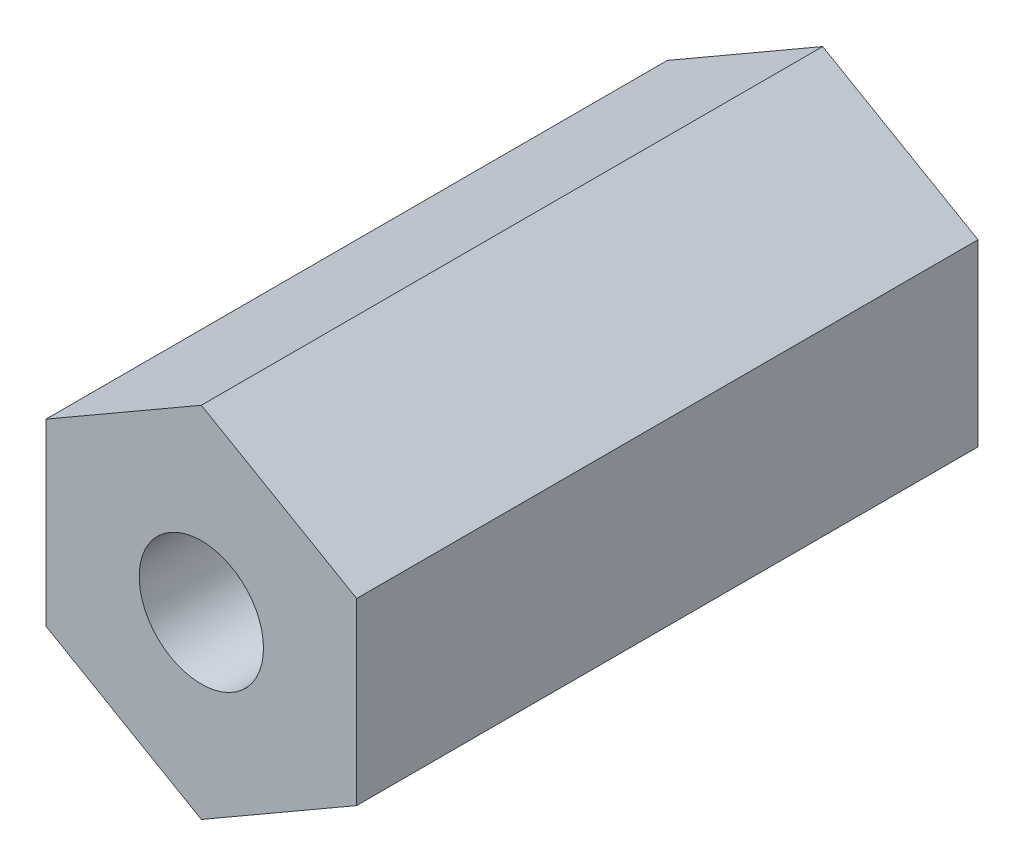
ISO-10303-21;
HEADER;
FILE_DESCRIPTION(('STEP AP214'),'2;1');
FILE_NAME('part.step','',(''),(''),'','','');
FILE_SCHEMA(('AUTOMOTIVE_DESIGN { 1 0 10303 214 1 1 1 1 }'));
ENDSEC;
DATA;
#1=APPLICATION_CONTEXT('core data for automotive mechanical design processes');
#2=APPLICATION_PROTOCOL_DEFINITION('international standard','automotive_design',2000,#1);
#3=PRODUCT_CONTEXT('',#1,'mechanical');
#4=PRODUCT('Part','Part','',(#3));
#5=PRODUCT_RELATED_PRODUCT_CATEGORY('part','',(#4));
#6=PRODUCT_DEFINITION_FORMATION('','',#4);
#7=PRODUCT_DEFINITION_CONTEXT('part definition',#1,'design');
#8=PRODUCT_DEFINITION('design','',#6,#7);
#9=PRODUCT_DEFINITION_SHAPE('','',#8);
#10=(LENGTH_UNIT() NAMED_UNIT(*) SI_UNIT(.MILLI.,.METRE.));
#11=(NAMED_UNIT(*) PLANE_ANGLE_UNIT() SI_UNIT($,.RADIAN.));
#12=(NAMED_UNIT(*) SI_UNIT($,.STERADIAN.) SOLID_ANGLE_UNIT());
#13=UNCERTAINTY_MEASURE_WITH_UNIT(LENGTH_MEASURE(1.E-05),#10,'distance_accuracy_value','');
#14=(GEOMETRIC_REPRESENTATION_CONTEXT(3) GLOBAL_UNCERTAINTY_ASSIGNED_CONTEXT((#13)) GLOBAL_UNIT_ASSIGNED_CONTEXT((#10,
#11,#12)) REPRESENTATION_CONTEXT('',''));
#15=CARTESIAN_POINT('',(0.,0.,0.));
#16=DIRECTION('',(0.,0.,1.));
#17=DIRECTION('',(1.,0.,0.));
#18=AXIS2_PLACEMENT_3D('',#15,#16,#17);
#19=CARTESIAN_POINT('',(6.35,3.66617420935412,12.7));
#20=DIRECTION('',(-0.5,-0.866025403784439,0.));
#21=DIRECTION('',(0.866025403784439,-0.5,0.));
#22=AXIS2_PLACEMENT_3D('',#19,#20,#21);
#23=PLANE('',#22);
#24=DIRECTION('',(-0.866025403784439,0.5,0.));
#25=VECTOR('',#24,1.);
#26=CARTESIAN_POINT('',(6.35,3.66617420935412,-12.7));
#27=LINE('',#26,#25);
#28=CARTESIAN_POINT('',(6.35,3.66617420935412,-12.7));
#29=VERTEX_POINT('',#28);
#30=CARTESIAN_POINT('',(0.,7.33234841870825,-12.7));
#31=VERTEX_POINT('',#30);
#32=EDGE_CURVE('E119',#29,#31,#27,.T.);
#33=ORIENTED_EDGE('',*,*,#32,.T.);
#34=DIRECTION('',(0.,0.,-1.));
#35=VECTOR('',#34,1.);
#36=CARTESIAN_POINT('',(0.,7.33234841870825,12.7));
#37=LINE('',#36,#35);
#38=CARTESIAN_POINT('',(0.,7.33234841870825,12.7));
#39=VERTEX_POINT('',#38);
#40=EDGE_CURVE('E11',#39,#31,#37,.T.);
#41=ORIENTED_EDGE('',*,*,#40,.F.);
#42=DIRECTION('',(-0.866025403784439,0.5,0.));
#43=VECTOR('',#42,1.);
#44=CARTESIAN_POINT('',(6.35,3.66617420935412,12.7));
#45=LINE('',#44,#43);
#46=CARTESIAN_POINT('',(6.35,3.66617420935412,12.7));
#47=VERTEX_POINT('',#46);
#48=EDGE_CURVE('E130',#47,#39,#45,.T.);
#49=ORIENTED_EDGE('',*,*,#48,.F.);
#50=DIRECTION('',(0.,0.,-1.));
#51=VECTOR('',#50,1.);
#52=CARTESIAN_POINT('',(6.35,3.66617420935412,12.7));
#53=LINE('',#52,#51);
#54=EDGE_CURVE('E115',#47,#29,#53,.T.);
#55=ORIENTED_EDGE('',*,*,#54,.T.);
#56=EDGE_LOOP('',(#33,#41,#49,#55));
#57=FACE_BOUND('',#56,.T.);
#58=ADVANCED_FACE('F35',(#57),#23,.F.);
#59=CARTESIAN_POINT('',(0.,7.33234841870825,12.7));
#60=DIRECTION('',(0.5,-0.866025403784439,0.));
#61=DIRECTION('',(0.866025403784439,0.5,0.));
#62=AXIS2_PLACEMENT_3D('',#59,#60,#61);
#63=PLANE('',#62);
#64=DIRECTION('',(-0.866025403784439,-0.5,0.));
#65=VECTOR('',#64,1.);
#66=CARTESIAN_POINT('',(0.,7.33234841870825,-12.7));
#67=LINE('',#66,#65);
#68=CARTESIAN_POINT('',(-6.35,3.66617420935413,-12.7));
#69=VERTEX_POINT('',#68);
#70=EDGE_CURVE('E122',#31,#69,#67,.T.);
#71=ORIENTED_EDGE('',*,*,#70,.T.);
#72=DIRECTION('',(0.,0.,-1.));
#73=VECTOR('',#72,1.);
#74=CARTESIAN_POINT('',(-6.35,3.66617420935413,12.7));
#75=LINE('',#74,#73);
#76=CARTESIAN_POINT('',(-6.35,3.66617420935413,12.7));
#77=VERTEX_POINT('',#76);
#78=EDGE_CURVE('E43',#77,#69,#75,.T.);
#79=ORIENTED_EDGE('',*,*,#78,.F.);
#80=DIRECTION('',(-0.866025403784439,-0.5,0.));
#81=VECTOR('',#80,1.);
#82=CARTESIAN_POINT('',(0.,7.33234841870825,12.7));
#83=LINE('',#82,#81);
#84=EDGE_CURVE('E88',#39,#77,#83,.T.);
#85=ORIENTED_EDGE('',*,*,#84,.F.);
#86=ORIENTED_EDGE('',*,*,#40,.T.);
#87=EDGE_LOOP('',(#71,#79,#85,#86));
#88=FACE_BOUND('',#87,.T.);
#89=ADVANCED_FACE('F155',(#88),#63,.F.);
#90=CARTESIAN_POINT('',(-6.35,3.66617420935413,12.7));
#91=DIRECTION('',(1.,0.,0.));
#92=DIRECTION('',(0.,1.,0.));
#93=AXIS2_PLACEMENT_3D('',#90,#91,#92);
#94=PLANE('',#93);
#95=DIRECTION('',(0.,-1.,0.));
#96=VECTOR('',#95,1.);
#97=CARTESIAN_POINT('',(-6.35,3.66617420935413,-12.7));
#98=LINE('',#97,#96);
#99=CARTESIAN_POINT('',(-6.35,-3.66617420935412,-12.7));
#100=VERTEX_POINT('',#99);
#101=EDGE_CURVE('E125',#69,#100,#98,.T.);
#102=ORIENTED_EDGE('',*,*,#101,.T.);
#103=DIRECTION('',(0.,0.,-1.));
#104=VECTOR('',#103,1.);
#105=CARTESIAN_POINT('',(-6.35,-3.66617420935412,12.7));
#106=LINE('',#105,#104);
#107=CARTESIAN_POINT('',(-6.35,-3.66617420935412,12.7));
#108=VERTEX_POINT('',#107);
#109=EDGE_CURVE('E110',#108,#100,#106,.T.);
#110=ORIENTED_EDGE('',*,*,#109,.F.);
#111=DIRECTION('',(0.,-1.,0.));
#112=VECTOR('',#111,1.);
#113=CARTESIAN_POINT('',(-6.35,3.66617420935413,12.7));
#114=LINE('',#113,#112);
#115=EDGE_CURVE('E101',#77,#108,#114,.T.);
#116=ORIENTED_EDGE('',*,*,#115,.F.);
#117=ORIENTED_EDGE('',*,*,#78,.T.);
#118=EDGE_LOOP('',(#102,#110,#116,#117));
#119=FACE_BOUND('',#118,.T.);
#120=ADVANCED_FACE('F136',(#119),#94,.F.);
#121=CARTESIAN_POINT('',(-6.35,-3.66617420935412,12.7));
#122=DIRECTION('',(0.5,0.866025403784438,0.));
#123=DIRECTION('',(-0.866025403784439,0.5,0.));
#124=AXIS2_PLACEMENT_3D('',#121,#122,#123);
#125=PLANE('',#124);
#126=DIRECTION('',(0.866025403784438,-0.5,0.));
#127=VECTOR('',#126,1.);
#128=CARTESIAN_POINT('',(-6.35,-3.66617420935412,-12.7));
#129=LINE('',#128,#127);
#130=CARTESIAN_POINT('',(0.,-7.33234841870825,-12.7));
#131=VERTEX_POINT('',#130);
#132=EDGE_CURVE('E109',#100,#131,#129,.T.);
#133=ORIENTED_EDGE('',*,*,#132,.T.);
#134=DIRECTION('',(0.,0.,-1.));
#135=VECTOR('',#134,1.);
#136=CARTESIAN_POINT('',(0.,-7.33234841870825,12.7));
#137=LINE('',#136,#135);
#138=CARTESIAN_POINT('',(0.,-7.33234841870825,12.7));
#139=VERTEX_POINT('',#138);
#140=EDGE_CURVE('E106',#139,#131,#137,.T.);
#141=ORIENTED_EDGE('',*,*,#140,.F.);
#142=DIRECTION('',(0.866025403784438,-0.5,0.));
#143=VECTOR('',#142,1.);
#144=CARTESIAN_POINT('',(-6.35,-3.66617420935412,12.7));
#145=LINE('',#144,#143);
#146=EDGE_CURVE('E95',#108,#139,#145,.T.);
#147=ORIENTED_EDGE('',*,*,#146,.F.);
#148=ORIENTED_EDGE('',*,*,#109,.T.);
#149=EDGE_LOOP('',(#133,#141,#147,#148));
#150=FACE_BOUND('',#149,.T.);
#151=ADVANCED_FACE('F107',(#150),#125,.F.);
#152=CARTESIAN_POINT('',(0.,-7.33234841870825,12.7));
#153=DIRECTION('',(-0.5,0.866025403784438,0.));
#154=DIRECTION('',(-0.866025403784439,-0.5,0.));
#155=AXIS2_PLACEMENT_3D('',#152,#153,#154);
#156=PLANE('',#155);
#157=DIRECTION('',(0.866025403784438,0.5,0.));
#158=VECTOR('',#157,1.);
#159=CARTESIAN_POINT('',(0.,-7.33234841870825,-12.7));
#160=LINE('',#159,#158);
#161=CARTESIAN_POINT('',(6.35,-3.66617420935412,-12.7));
#162=VERTEX_POINT('',#161);
#163=EDGE_CURVE('E74',#131,#162,#160,.T.);
#164=ORIENTED_EDGE('',*,*,#163,.T.);
#165=DIRECTION('',(0.,0.,-1.));
#166=VECTOR('',#165,1.);
#167=CARTESIAN_POINT('',(6.35,-3.66617420935412,12.7));
#168=LINE('',#167,#166);
#169=CARTESIAN_POINT('',(6.35,-3.66617420935412,12.7));
#170=VERTEX_POINT('',#169);
#171=EDGE_CURVE('E111',#170,#162,#168,.T.);
#172=ORIENTED_EDGE('',*,*,#171,.F.);
#173=DIRECTION('',(0.866025403784438,0.5,0.));
#174=VECTOR('',#173,1.);
#175=CARTESIAN_POINT('',(0.,-7.33234841870825,12.7));
#176=LINE('',#175,#174);
#177=EDGE_CURVE('E99',#139,#170,#176,.T.);
#178=ORIENTED_EDGE('',*,*,#177,.F.);
#179=ORIENTED_EDGE('',*,*,#140,.T.);
#180=EDGE_LOOP('',(#164,#172,#178,#179));
#181=FACE_BOUND('',#180,.T.);
#182=ADVANCED_FACE('F113',(#181),#156,.F.);
#183=CARTESIAN_POINT('',(6.35,-3.66617420935412,12.7));
#184=DIRECTION('',(-1.,0.,0.));
#185=DIRECTION('',(0.,0.,1.));
#186=AXIS2_PLACEMENT_3D('',#183,#184,#185);
#187=PLANE('',#186);
#188=DIRECTION('',(0.,1.,0.));
#189=VECTOR('',#188,1.);
#190=CARTESIAN_POINT('',(6.35,-3.66617420935412,-12.7));
#191=LINE('',#190,#189);
#192=EDGE_CURVE('E80',#162,#29,#191,.T.);
#193=ORIENTED_EDGE('',*,*,#192,.T.);
#194=ORIENTED_EDGE('',*,*,#54,.F.);
#195=DIRECTION('',(0.,1.,0.));
#196=VECTOR('',#195,1.);
#197=CARTESIAN_POINT('',(6.35,-3.66617420935412,12.7));
#198=LINE('',#197,#196);
#199=EDGE_CURVE('E51',#170,#47,#198,.T.);
#200=ORIENTED_EDGE('',*,*,#199,.F.);
#201=ORIENTED_EDGE('',*,*,#171,.T.);
#202=EDGE_LOOP('',(#193,#194,#200,#201));
#203=FACE_BOUND('',#202,.T.);
#204=ADVANCED_FACE('F143',(#203),#187,.F.);
#205=CARTESIAN_POINT('',(0.,0.,12.7));
#206=DIRECTION('',(0.,0.,1.));
#207=DIRECTION('',(1.,0.,0.));
#208=AXIS2_PLACEMENT_3D('',#205,#206,#207);
#209=PLANE('',#208);
#210=CARTESIAN_POINT('',(0.,0.,12.7));
#211=DIRECTION('',(0.,0.,1.));
#212=DIRECTION('',(1.,0.,0.));
#213=AXIS2_PLACEMENT_3D('',#210,#211,#212);
#214=CIRCLE('',#213,2.54);
#215=CARTESIAN_POINT('',(2.54,0.,12.7));
#216=VERTEX_POINT('',#215);
#217=EDGE_CURVE('E123',#216,#216,#214,.T.);
#218=ORIENTED_EDGE('',*,*,#217,.F.);
#219=EDGE_LOOP('',(#218));
#220=FACE_BOUND('',#219,.T.);
#221=ORIENTED_EDGE('',*,*,#48,.T.);
#222=ORIENTED_EDGE('',*,*,#84,.T.);
#223=ORIENTED_EDGE('',*,*,#115,.T.);
#224=ORIENTED_EDGE('',*,*,#146,.T.);
#225=ORIENTED_EDGE('',*,*,#177,.T.);
#226=ORIENTED_EDGE('',*,*,#199,.T.);
#227=EDGE_LOOP('',(#221,#222,#223,#224,#225,#226));
#228=FACE_BOUND('',#227,.T.);
#229=ADVANCED_FACE('F97',(#220,#228),#209,.T.);
#230=CARTESIAN_POINT('',(0.,0.,-12.7));
#231=DIRECTION('',(0.,0.,1.));
#232=DIRECTION('',(1.,0.,0.));
#233=AXIS2_PLACEMENT_3D('',#230,#231,#232);
#234=PLANE('',#233);
#235=CARTESIAN_POINT('',(0.,0.,-12.7));
#236=DIRECTION('',(0.,0.,1.));
#237=DIRECTION('',(1.,0.,0.));
#238=AXIS2_PLACEMENT_3D('',#235,#236,#237);
#239=CIRCLE('',#238,2.54);
#240=CARTESIAN_POINT('',(2.54,0.,-12.7));
#241=VERTEX_POINT('',#240);
#242=EDGE_CURVE('E210',#241,#241,#239,.T.);
#243=ORIENTED_EDGE('',*,*,#242,.T.);
#244=EDGE_LOOP('',(#243));
#245=FACE_BOUND('',#244,.T.);
#246=ORIENTED_EDGE('',*,*,#32,.F.);
#247=ORIENTED_EDGE('',*,*,#192,.F.);
#248=ORIENTED_EDGE('',*,*,#163,.F.);
#249=ORIENTED_EDGE('',*,*,#132,.F.);
#250=ORIENTED_EDGE('',*,*,#101,.F.);
#251=ORIENTED_EDGE('',*,*,#70,.F.);
#252=EDGE_LOOP('',(#246,#247,#248,#249,#250,#251));
#253=FACE_BOUND('',#252,.T.);
#254=ADVANCED_FACE('F139',(#245,#253),#234,.F.);
#255=CARTESIAN_POINT('',(0.,0.,-12.7));
#256=DIRECTION('',(0.,0.,1.));
#257=DIRECTION('',(1.,0.,0.));
#258=AXIS2_PLACEMENT_3D('',#255,#256,#257);
#259=CYLINDRICAL_SURFACE('',#258,2.54);
#260=ORIENTED_EDGE('',*,*,#217,.T.);
#261=EDGE_LOOP('',(#260));
#262=FACE_BOUND('',#261,.T.);
#263=ORIENTED_EDGE('',*,*,#242,.F.);
#264=EDGE_LOOP('',(#263));
#265=FACE_BOUND('',#264,.T.);
#266=ADVANCED_FACE('F192',(#262,#265),#259,.F.);
#267=CLOSED_SHELL('',(#58,#89,#120,#151,#182,#204,#229,#254,#266));
#268=MANIFOLD_SOLID_BREP('B2',#267);
#269=ADVANCED_BREP_SHAPE_REPRESENTATION('',(#18,#268),#14);
#270=SHAPE_DEFINITION_REPRESENTATION(#9,#269);
ENDSEC;
END-ISO-10303-21;
